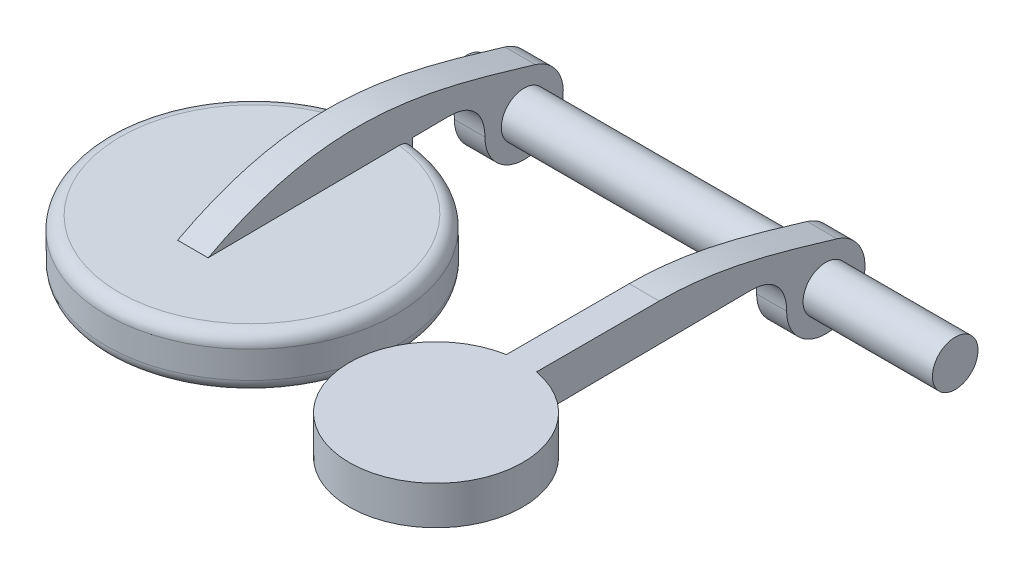
ISO-10303-21;
HEADER;
FILE_DESCRIPTION(('STEP AP214'),'2;1');
FILE_NAME('part.step','',(''),(''),'','','');
FILE_SCHEMA(('AUTOMOTIVE_DESIGN { 1 0 10303 214 1 1 1 1 }'));
ENDSEC;
DATA;
#1=APPLICATION_CONTEXT('core data for automotive mechanical design processes');
#2=APPLICATION_PROTOCOL_DEFINITION('international standard','automotive_design',2000,#1);
#3=PRODUCT_CONTEXT('',#1,'mechanical');
#4=PRODUCT('Part','Part','',(#3));
#5=PRODUCT_RELATED_PRODUCT_CATEGORY('part','',(#4));
#6=PRODUCT_DEFINITION_FORMATION('','',#4);
#7=PRODUCT_DEFINITION_CONTEXT('part definition',#1,'design');
#8=PRODUCT_DEFINITION('design','',#6,#7);
#9=PRODUCT_DEFINITION_SHAPE('','',#8);
#10=(LENGTH_UNIT() NAMED_UNIT(*) SI_UNIT(.MILLI.,.METRE.));
#11=(NAMED_UNIT(*) PLANE_ANGLE_UNIT() SI_UNIT($,.RADIAN.));
#12=(NAMED_UNIT(*) SI_UNIT($,.STERADIAN.) SOLID_ANGLE_UNIT());
#13=UNCERTAINTY_MEASURE_WITH_UNIT(LENGTH_MEASURE(1.E-05),#10,'distance_accuracy_value','');
#14=(GEOMETRIC_REPRESENTATION_CONTEXT(3) GLOBAL_UNCERTAINTY_ASSIGNED_CONTEXT((#13)) GLOBAL_UNIT_ASSIGNED_CONTEXT((#10,
#11,#12)) REPRESENTATION_CONTEXT('',''));
#15=CARTESIAN_POINT('',(0.,0.,0.));
#16=DIRECTION('',(0.,0.,1.));
#17=DIRECTION('',(1.,0.,0.));
#18=AXIS2_PLACEMENT_3D('',#15,#16,#17);
#19=CARTESIAN_POINT('',(35.2298,7.12391670081777,29.0513749527694));
#20=DIRECTION('',(0.,0.,-1.));
#21=DIRECTION('',(0.,1.,0.));
#22=AXIS2_PLACEMENT_3D('',#19,#20,#21);
#23=PLANE('',#22);
#24=DIRECTION('',(1.,0.,0.));
#25=VECTOR('',#24,1.);
#26=CARTESIAN_POINT('',(35.2298,3.34153169983561,29.0513749527694));
#27=LINE('',#26,#25);
#28=CARTESIAN_POINT('',(32.2834,3.34153169983561,29.0513749527694));
#29=VERTEX_POINT('',#28);
#30=CARTESIAN_POINT('',(35.2298,3.34153169983561,29.0513749527694));
#31=VERTEX_POINT('',#30);
#32=EDGE_CURVE('E669',#29,#31,#27,.T.);
#33=ORIENTED_EDGE('',*,*,#32,.F.);
#34=DIRECTION('',(0.,-1.,0.));
#35=VECTOR('',#34,1.);
#36=CARTESIAN_POINT('',(32.2834,7.12391670081777,29.0513749527694));
#37=LINE('',#36,#35);
#38=CARTESIAN_POINT('',(32.2834,3.33429589993566,29.0513749527694));
#39=VERTEX_POINT('',#38);
#40=EDGE_CURVE('E623',#29,#39,#37,.T.);
#41=ORIENTED_EDGE('',*,*,#40,.T.);
#42=DIRECTION('',(-1.,0.,0.));
#43=VECTOR('',#42,1.);
#44=CARTESIAN_POINT('',(35.2298,3.33429589993566,29.0513749527694));
#45=LINE('',#44,#43);
#46=CARTESIAN_POINT('',(35.2298,3.33429589993566,29.0513749527694));
#47=VERTEX_POINT('',#46);
#48=EDGE_CURVE('E649',#47,#39,#45,.T.);
#49=ORIENTED_EDGE('',*,*,#48,.F.);
#50=DIRECTION('',(0.,-1.,0.));
#51=VECTOR('',#50,1.);
#52=CARTESIAN_POINT('',(35.2298,7.12391670081777,29.0513749527694));
#53=LINE('',#52,#51);
#54=EDGE_CURVE('E174',#31,#47,#53,.T.);
#55=ORIENTED_EDGE('',*,*,#54,.F.);
#56=EDGE_LOOP('',(#33,#41,#49,#55));
#57=FACE_BOUND('',#56,.T.);
#58=ADVANCED_FACE('F39',(#57),#23,.F.);
#59=CARTESIAN_POINT('',(35.2298,6.06436235293988,7.59443350800524));
#60=DIRECTION('',(-1.,0.,0.));
#61=DIRECTION('',(0.,0.,1.));
#62=AXIS2_PLACEMENT_3D('',#59,#60,#61);
#63=PLANE('',#62);
#64=CARTESIAN_POINT('',(35.2298,0.,0.));
#65=DIRECTION('',(-1.,0.,0.));
#66=DIRECTION('',(0.,0.,1.));
#67=AXIS2_PLACEMENT_3D('',#64,#65,#66);
#68=CIRCLE('',#67,2.2352);
#69=CARTESIAN_POINT('',(35.2298,0.,2.2352));
#70=VERTEX_POINT('',#69);
#71=EDGE_CURVE('E251',#70,#70,#68,.T.);
#72=ORIENTED_EDGE('',*,*,#71,.T.);
#73=EDGE_LOOP('',(#72));
#74=FACE_BOUND('',#73,.T.);
#75=DIRECTION('',(0.,1.,0.));
#76=VECTOR('',#75,1.);
#77=CARTESIAN_POINT('',(35.2298,7.12391670081777,28.4061917155948));
#78=LINE('',#77,#76);
#79=CARTESIAN_POINT('',(35.2298,3.34153169983561,28.4061917155948));
#80=VERTEX_POINT('',#79);
#81=CARTESIAN_POINT('',(35.2298,7.12391670081777,28.4061917155948));
#82=VERTEX_POINT('',#81);
#83=EDGE_CURVE('E147',#80,#82,#78,.T.);
#84=ORIENTED_EDGE('',*,*,#83,.F.);
#85=DIRECTION('',(0.,0.,-1.));
#86=VECTOR('',#85,1.);
#87=CARTESIAN_POINT('',(35.2298,3.34153169983561,7.59443350800524));
#88=LINE('',#87,#86);
#89=EDGE_CURVE('E158',#31,#80,#88,.T.);
#90=ORIENTED_EDGE('',*,*,#89,.F.);
#91=ORIENTED_EDGE('',*,*,#54,.T.);
#92=DIRECTION('',(0.,0.00935198459330915,-0.999956269235893));
#93=VECTOR('',#92,1.);
#94=CARTESIAN_POINT('',(35.2298,3.33429589993566,29.0513749527694));
#95=LINE('',#94,#93);
#96=CARTESIAN_POINT('',(35.2298,3.53607699929893,7.47603195381129));
#97=VERTEX_POINT('',#96);
#98=EDGE_CURVE('E178',#47,#97,#95,.T.);
#99=ORIENTED_EDGE('',*,*,#98,.T.);
#100=CARTESIAN_POINT('',(35.2298,3.53607699929893,7.47603195381129));
#101=CARTESIAN_POINT('',(35.2298,3.54651463477211,6.35999300793146));
#102=CARTESIAN_POINT('',(35.2298,2.93410125259208,4.61869351978473));
#103=CARTESIAN_POINT('',(35.2298,1.17220412261583,3.84810000000003));
#104=CARTESIAN_POINT('',(35.2298,0.,3.84810000000003));
#105=B_SPLINE_CURVE_WITH_KNOTS('',3,(#100,#101,#102,#103,#104),.UNSPECIFIED.,.F.,.F.,(4,1,4),
(0.,0.48535143959245,1.),.UNSPECIFIED.);
#106=CARTESIAN_POINT('',(35.2298,0.,3.84810000000003));
#107=VERTEX_POINT('',#106);
#108=EDGE_CURVE('E188',#97,#107,#105,.T.);
#109=ORIENTED_EDGE('',*,*,#108,.T.);
#110=CARTESIAN_POINT('',(35.2298,0.,0.));
#111=DIRECTION('',(1.,0.,0.));
#112=DIRECTION('',(0.,0.,-1.));
#113=AXIS2_PLACEMENT_3D('',#110,#111,#112);
#114=CIRCLE('',#113,3.84810000000002);
#115=CARTESIAN_POINT('',(35.2298,3.6860916578753,-1.10480853533195));
#116=VERTEX_POINT('',#115);
#117=EDGE_CURVE('E194',#107,#116,#114,.T.);
#118=ORIENTED_EDGE('',*,*,#117,.T.);
#119=CARTESIAN_POINT('',(35.2298,3.6860916578753,-1.10480853533195));
#120=CARTESIAN_POINT('',(35.2298,5.44438012079105,4.7615585572655));
#121=CARTESIAN_POINT('',(35.2298,7.12391670081761,10.4080753249363));
#122=CARTESIAN_POINT('',(35.2298,7.12391670081777,16.3513749527685));
#123=B_SPLINE_CURVE_WITH_KNOTS('',3,(#119,#120,#121,#122),.UNSPECIFIED.,.F.,.F.,(4,4),(0.,
0.562301624485056),.UNSPECIFIED.);
#124=CARTESIAN_POINT('',(35.2298,7.12391670081777,16.3513749527694));
#125=VERTEX_POINT('',#124);
#126=EDGE_CURVE('E171',#116,#125,#123,.T.);
#127=ORIENTED_EDGE('',*,*,#126,.T.);
#128=DIRECTION('',(0.,0.,1.));
#129=VECTOR('',#128,1.);
#130=CARTESIAN_POINT('',(35.2298,7.12391670081777,16.3513749527694));
#131=LINE('',#130,#129);
#132=EDGE_CURVE('E164',#125,#82,#131,.T.);
#133=ORIENTED_EDGE('',*,*,#132,.T.);
#134=EDGE_LOOP('',(#84,#90,#91,#99,#109,#118,#127,#133));
#135=FACE_BOUND('',#134,.T.);
#136=ADVANCED_FACE('F169',(#74,#135),#63,.F.);
#137=CARTESIAN_POINT('',(32.2834,6.06436235293988,7.59443350800524));
#138=DIRECTION('',(-1.,0.,0.));
#139=DIRECTION('',(0.,0.,1.));
#140=AXIS2_PLACEMENT_3D('',#137,#138,#139);
#141=PLANE('',#140);
#142=CARTESIAN_POINT('',(32.2834,0.,0.));
#143=DIRECTION('',(-1.,0.,0.));
#144=DIRECTION('',(0.,0.,1.));
#145=AXIS2_PLACEMENT_3D('',#142,#143,#144);
#146=CIRCLE('',#145,2.2352);
#147=CARTESIAN_POINT('',(32.2834,0.,2.2352));
#148=VERTEX_POINT('',#147);
#149=EDGE_CURVE('E258',#148,#148,#146,.T.);
#150=ORIENTED_EDGE('',*,*,#149,.F.);
#151=EDGE_LOOP('',(#150));
#152=FACE_BOUND('',#151,.T.);
#153=DIRECTION('',(0.,0.,-1.));
#154=VECTOR('',#153,1.);
#155=CARTESIAN_POINT('',(32.2834,3.34153169983561,7.59443350800524));
#156=LINE('',#155,#154);
#157=CARTESIAN_POINT('',(32.2834,3.34153169983561,28.4061917155948));
#158=VERTEX_POINT('',#157);
#159=EDGE_CURVE('E48',#29,#158,#156,.T.);
#160=ORIENTED_EDGE('',*,*,#159,.T.);
#161=DIRECTION('',(0.,1.,0.));
#162=VECTOR('',#161,1.);
#163=CARTESIAN_POINT('',(32.2834,7.12391670081777,28.4061917155948));
#164=LINE('',#163,#162);
#165=CARTESIAN_POINT('',(32.2834,7.12391670081777,28.4061917155948));
#166=VERTEX_POINT('',#165);
#167=EDGE_CURVE('E11',#158,#166,#164,.T.);
#168=ORIENTED_EDGE('',*,*,#167,.T.);
#169=DIRECTION('',(0.,0.,1.));
#170=VECTOR('',#169,1.);
#171=CARTESIAN_POINT('',(32.2834,7.12391670081777,16.3513749527694));
#172=LINE('',#171,#170);
#173=CARTESIAN_POINT('',(32.2834,7.12391670081777,16.3513749527694));
#174=VERTEX_POINT('',#173);
#175=EDGE_CURVE('E166',#174,#166,#172,.T.);
#176=ORIENTED_EDGE('',*,*,#175,.F.);
#177=CARTESIAN_POINT('',(32.2834,3.6860916578753,-1.10480853533195));
#178=CARTESIAN_POINT('',(32.2834,5.44438012079105,4.7615585572655));
#179=CARTESIAN_POINT('',(32.2834,7.12391670081761,10.4080753249363));
#180=CARTESIAN_POINT('',(32.2834,7.12391670081777,16.3513749527685));
#181=B_SPLINE_CURVE_WITH_KNOTS('',3,(#177,#178,#179,#180),.UNSPECIFIED.,.F.,.F.,(4,4),(0.,
0.562301624485056),.UNSPECIFIED.);
#182=CARTESIAN_POINT('',(32.2834,3.6860916578753,-1.10480853533195));
#183=VERTEX_POINT('',#182);
#184=EDGE_CURVE('E157',#183,#174,#181,.T.);
#185=ORIENTED_EDGE('',*,*,#184,.F.);
#186=CARTESIAN_POINT('',(32.2834,0.,0.));
#187=DIRECTION('',(1.,0.,0.));
#188=DIRECTION('',(0.,0.,-1.));
#189=AXIS2_PLACEMENT_3D('',#186,#187,#188);
#190=CIRCLE('',#189,3.84810000000002);
#191=CARTESIAN_POINT('',(32.2834,0.,3.84810000000003));
#192=VERTEX_POINT('',#191);
#193=EDGE_CURVE('E180',#192,#183,#190,.T.);
#194=ORIENTED_EDGE('',*,*,#193,.F.);
#195=CARTESIAN_POINT('',(32.2834,3.53607699929893,7.47603195381129));
#196=CARTESIAN_POINT('',(32.2834,3.54651463477211,6.35999300793146));
#197=CARTESIAN_POINT('',(32.2834,2.93410125259208,4.61869351978473));
#198=CARTESIAN_POINT('',(32.2834,1.17220412261583,3.84810000000003));
#199=CARTESIAN_POINT('',(32.2834,0.,3.84810000000003));
#200=B_SPLINE_CURVE_WITH_KNOTS('',3,(#195,#196,#197,#198,#199),.UNSPECIFIED.,.F.,.F.,(4,1,4),
(0.,0.48535143959245,1.),.UNSPECIFIED.);
#201=CARTESIAN_POINT('',(32.2834,3.53607699929893,7.47603195381129));
#202=VERTEX_POINT('',#201);
#203=EDGE_CURVE('E615',#202,#192,#200,.T.);
#204=ORIENTED_EDGE('',*,*,#203,.F.);
#205=DIRECTION('',(0.,0.00935198459330915,-0.999956269235893));
#206=VECTOR('',#205,1.);
#207=CARTESIAN_POINT('',(32.2834,3.33429589993566,29.0513749527694));
#208=LINE('',#207,#206);
#209=EDGE_CURVE('E633',#39,#202,#208,.T.);
#210=ORIENTED_EDGE('',*,*,#209,.F.);
#211=ORIENTED_EDGE('',*,*,#40,.F.);
#212=EDGE_LOOP('',(#160,#168,#176,#185,#194,#204,#210,#211));
#213=FACE_BOUND('',#212,.T.);
#214=ADVANCED_FACE('F463',(#152,#213),#141,.T.);
#215=CARTESIAN_POINT('',(47.9298,0.,0.));
#216=DIRECTION('',(-1.,0.,0.));
#217=DIRECTION('',(0.,0.,1.));
#218=AXIS2_PLACEMENT_3D('',#215,#216,#217);
#219=CYLINDRICAL_SURFACE('',#218,2.2352);
#220=ORIENTED_EDGE('',*,*,#149,.T.);
#221=EDGE_LOOP('',(#220));
#222=FACE_BOUND('',#221,.T.);
#223=CARTESIAN_POINT('',(5.6134,0.,0.));
#224=DIRECTION('',(-1.,0.,0.));
#225=DIRECTION('',(0.,0.,1.));
#226=AXIS2_PLACEMENT_3D('',#223,#224,#225);
#227=CIRCLE('',#226,2.2352);
#228=CARTESIAN_POINT('',(5.6134,0.,2.2352));
#229=VERTEX_POINT('',#228);
#230=EDGE_CURVE('E377',#229,#229,#227,.T.);
#231=ORIENTED_EDGE('',*,*,#230,.F.);
#232=EDGE_LOOP('',(#231));
#233=FACE_BOUND('',#232,.T.);
#234=ADVANCED_FACE('F270',(#222,#233),#219,.T.);
#235=CARTESIAN_POINT('',(5.6134,3.6860916578753,-1.10480853533195));
#236=CARTESIAN_POINT('',(5.6134,6.81304058768846,9.32796782018675));
#237=CARTESIAN_POINT('',(5.6134,9.69091903055826,19.0654182295158));
#238=CARTESIAN_POINT('',(5.6134,3.31594626947891,31.0134));
#239=B_SPLINE_CURVE_WITH_KNOTS('',3,(#235,#236,#237,#238),.UNSPECIFIED.,.F.,.F.,(4,4),(0.,1.),.UNSPECIFIED.);
#240=DIRECTION('',(-1.,0.,0.));
#241=VECTOR('',#240,1.);
#242=SURFACE_OF_LINEAR_EXTRUSION('',#239,#241);
#243=CARTESIAN_POINT('',(2.6162,3.6860916578753,-1.10480853533195));
#244=CARTESIAN_POINT('',(2.6162,6.81304058768846,9.32796782018675));
#245=CARTESIAN_POINT('',(2.6162,9.69091903055826,19.0654182295158));
#246=CARTESIAN_POINT('',(2.6162,3.31594626947891,31.0134));
#247=B_SPLINE_CURVE_WITH_KNOTS('',3,(#243,#244,#245,#246),.UNSPECIFIED.,.F.,.F.,(4,4),(0.,1.),.UNSPECIFIED.);
#248=CARTESIAN_POINT('',(2.6162,3.68609165787529,-1.10480853533194));
#249=VERTEX_POINT('',#248);
#250=CARTESIAN_POINT('',(2.6162,3.31594626947891,31.0134));
#251=VERTEX_POINT('',#250);
#252=EDGE_CURVE('E338',#249,#251,#247,.T.);
#253=ORIENTED_EDGE('',*,*,#252,.T.);
#254=DIRECTION('',(-1.,0.,0.));
#255=VECTOR('',#254,1.);
#256=CARTESIAN_POINT('',(5.6134,3.31594626947891,31.0134));
#257=LINE('',#256,#255);
#258=CARTESIAN_POINT('',(5.6134,3.31594626947891,31.0134));
#259=VERTEX_POINT('',#258);
#260=EDGE_CURVE('E369',#259,#251,#257,.T.);
#261=ORIENTED_EDGE('',*,*,#260,.F.);
#262=CARTESIAN_POINT('',(5.6134,3.68609165787529,-1.10480853533194));
#263=VERTEX_POINT('',#262);
#264=EDGE_CURVE('E285',#263,#259,#239,.T.);
#265=ORIENTED_EDGE('',*,*,#264,.F.);
#266=DIRECTION('',(-1.,0.,0.));
#267=VECTOR('',#266,1.);
#268=CARTESIAN_POINT('',(5.6134,3.68609165787529,-1.10480853533194));
#269=LINE('',#268,#267);
#270=EDGE_CURVE('E326',#263,#249,#269,.T.);
#271=ORIENTED_EDGE('',*,*,#270,.T.);
#272=EDGE_LOOP('',(#253,#261,#265,#271));
#273=FACE_BOUND('',#272,.T.);
#274=ADVANCED_FACE('F278',(#273),#242,.F.);
#275=CARTESIAN_POINT('',(5.6134,3.31594626947891,31.0134));
#276=DIRECTION('',(0.,0.999956269235893,0.00935198459330916));
#277=DIRECTION('',(0.,-0.00935198459330916,0.999956269235893));
#278=AXIS2_PLACEMENT_3D('',#275,#276,#277);
#279=PLANE('',#278);
#280=CARTESIAN_POINT('',(4.1148,3.37021523518662,25.2107180191933));
#281=DIRECTION('',(0.,-0.999956269235894,-0.00935198459330916));
#282=DIRECTION('',(0.,0.00935198459330916,-0.999956269235894));
#283=AXIS2_PLACEMENT_3D('',#280,#281,#282);
#284=CIRCLE('',#283,14.3129);
#285=CARTESIAN_POINT('',(2.6162,3.50333353509295,10.9771104663545));
#286=VERTEX_POINT('',#285);
#287=CARTESIAN_POINT('',(5.6134,3.50333353509295,10.9771104663545));
#288=VERTEX_POINT('',#287);
#289=EDGE_CURVE('E294',#286,#288,#284,.T.);
#290=ORIENTED_EDGE('',*,*,#289,.F.);
#291=DIRECTION('',(0.,0.00935198459330916,-0.999956269235893));
#292=VECTOR('',#291,1.);
#293=CARTESIAN_POINT('',(2.6162,3.31594626947891,31.0134));
#294=LINE('',#293,#292);
#295=CARTESIAN_POINT('',(2.6162,3.53607699929893,7.47603195381129));
#296=VERTEX_POINT('',#295);
#297=EDGE_CURVE('E345',#286,#296,#294,.T.);
#298=ORIENTED_EDGE('',*,*,#297,.T.);
#299=DIRECTION('',(-1.,0.,0.));
#300=VECTOR('',#299,1.);
#301=CARTESIAN_POINT('',(5.6134,3.53607699929893,7.47603195381129));
#302=LINE('',#301,#300);
#303=CARTESIAN_POINT('',(5.6134,3.53607699929893,7.47603195381129));
#304=VERTEX_POINT('',#303);
#305=EDGE_CURVE('E365',#304,#296,#302,.T.);
#306=ORIENTED_EDGE('',*,*,#305,.F.);
#307=DIRECTION('',(0.,0.00935198459330916,-0.999956269235893));
#308=VECTOR('',#307,1.);
#309=CARTESIAN_POINT('',(5.6134,3.31594626947891,31.0134));
#310=LINE('',#309,#308);
#311=EDGE_CURVE('E292',#288,#304,#310,.T.);
#312=ORIENTED_EDGE('',*,*,#311,.F.);
#313=EDGE_LOOP('',(#290,#298,#306,#312));
#314=FACE_BOUND('',#313,.T.);
#315=ADVANCED_FACE('F282',(#314),#279,.F.);
#316=CARTESIAN_POINT('',(5.6134,3.53607699929893,7.47603195381129));
#317=CARTESIAN_POINT('',(5.6134,3.54651463477211,6.35999300793146));
#318=CARTESIAN_POINT('',(5.6134,2.93410125259208,4.61869351978473));
#319=CARTESIAN_POINT('',(5.6134,1.17220412261583,3.84810000000003));
#320=CARTESIAN_POINT('',(5.6134,0.,3.84810000000003));
#321=B_SPLINE_CURVE_WITH_KNOTS('',3,(#316,#317,#318,#319,#320),.UNSPECIFIED.,.F.,.F.,(4,1,4),
(0.,0.48535143959245,1.),.UNSPECIFIED.);
#322=DIRECTION('',(-1.,0.,0.));
#323=VECTOR('',#322,1.);
#324=SURFACE_OF_LINEAR_EXTRUSION('',#321,#323);
#325=CARTESIAN_POINT('',(2.6162,3.53607699929893,7.47603195381129));
#326=CARTESIAN_POINT('',(2.6162,3.54651463477211,6.35999300793146));
#327=CARTESIAN_POINT('',(2.6162,2.93410125259208,4.61869351978473));
#328=CARTESIAN_POINT('',(2.6162,1.17220412261583,3.84810000000003));
#329=CARTESIAN_POINT('',(2.6162,0.,3.84810000000003));
#330=B_SPLINE_CURVE_WITH_KNOTS('',3,(#325,#326,#327,#328,#329),.UNSPECIFIED.,.F.,.F.,(4,1,4),
(0.,0.48535143959245,1.),.UNSPECIFIED.);
#331=CARTESIAN_POINT('',(2.6162,0.,3.84810000000003));
#332=VERTEX_POINT('',#331);
#333=EDGE_CURVE('E334',#296,#332,#330,.T.);
#334=ORIENTED_EDGE('',*,*,#333,.T.);
#335=DIRECTION('',(-1.,0.,0.));
#336=VECTOR('',#335,1.);
#337=CARTESIAN_POINT('',(5.6134,0.,3.84810000000003));
#338=LINE('',#337,#336);
#339=CARTESIAN_POINT('',(5.6134,0.,3.84810000000003));
#340=VERTEX_POINT('',#339);
#341=EDGE_CURVE('E329',#340,#332,#338,.T.);
#342=ORIENTED_EDGE('',*,*,#341,.F.);
#343=EDGE_CURVE('E303',#304,#340,#321,.T.);
#344=ORIENTED_EDGE('',*,*,#343,.F.);
#345=ORIENTED_EDGE('',*,*,#305,.T.);
#346=EDGE_LOOP('',(#334,#342,#344,#345));
#347=FACE_BOUND('',#346,.T.);
#348=ADVANCED_FACE('F314',(#347),#324,.F.);
#349=CARTESIAN_POINT('',(5.6134,0.,0.));
#350=DIRECTION('',(-1.,0.,0.));
#351=DIRECTION('',(0.,0.,1.));
#352=AXIS2_PLACEMENT_3D('',#349,#350,#351);
#353=CYLINDRICAL_SURFACE('',#352,3.84810000000001);
#354=CARTESIAN_POINT('',(2.6162,0.,0.));
#355=DIRECTION('',(1.,0.,0.));
#356=DIRECTION('',(0.,0.,-1.));
#357=AXIS2_PLACEMENT_3D('',#354,#355,#356);
#358=CIRCLE('',#357,3.84810000000001);
#359=EDGE_CURVE('E293',#332,#249,#358,.T.);
#360=ORIENTED_EDGE('',*,*,#359,.T.);
#361=ORIENTED_EDGE('',*,*,#270,.F.);
#362=CARTESIAN_POINT('',(5.6134,0.,0.));
#363=DIRECTION('',(1.,0.,0.));
#364=DIRECTION('',(0.,0.,-1.));
#365=AXIS2_PLACEMENT_3D('',#362,#363,#364);
#366=CIRCLE('',#365,3.84810000000001);
#367=EDGE_CURVE('E309',#340,#263,#366,.T.);
#368=ORIENTED_EDGE('',*,*,#367,.F.);
#369=ORIENTED_EDGE('',*,*,#341,.T.);
#370=EDGE_LOOP('',(#360,#361,#368,#369));
#371=FACE_BOUND('',#370,.T.);
#372=ADVANCED_FACE('F238',(#371),#353,.T.);
#373=CARTESIAN_POINT('',(5.6134,7.0642395977618,14.3860937017219));
#374=DIRECTION('',(-1.,0.,0.));
#375=DIRECTION('',(0.,0.,1.));
#376=AXIS2_PLACEMENT_3D('',#373,#374,#375);
#377=PLANE('',#376);
#378=ORIENTED_EDGE('',*,*,#230,.T.);
#379=EDGE_LOOP('',(#378));
#380=FACE_BOUND('',#379,.T.);
#381=ORIENTED_EDGE('',*,*,#264,.T.);
#382=CARTESIAN_POINT('',(5.6134,3.49138442069289,12.2547635395541));
#383=VERTEX_POINT('',#382);
#384=EDGE_CURVE('E296',#259,#383,#310,.T.);
#385=ORIENTED_EDGE('',*,*,#384,.T.);
#386=CARTESIAN_POINT('',(5.6134,3.49138442069289,12.2547635395541));
#387=CARTESIAN_POINT('',(5.6134,3.49172181561903,12.2186489938396));
#388=CARTESIAN_POINT('',(5.6134,3.49053863151365,12.1825373954026));
#389=CARTESIAN_POINT('',(5.6134,3.4851425657969,12.1105424267928));
#390=CARTESIAN_POINT('',(5.6134,3.48092977434672,12.0746590498601));
#391=CARTESIAN_POINT('',(5.6134,3.46378063501387,11.9677847158064));
#392=CARTESIAN_POINT('',(5.6134,3.44633441994632,11.8974637440835));
#393=CARTESIAN_POINT('',(5.6134,3.3998723689284,11.760747218484));
#394=CARTESIAN_POINT('',(5.6134,3.37084995174271,11.6943539222445));
#395=CARTESIAN_POINT('',(5.6134,3.30203750094072,11.5674106030419));
#396=CARTESIAN_POINT('',(5.6134,3.26225005184668,11.5068591822598));
#397=CARTESIAN_POINT('',(5.6134,3.17316848253026,11.3935442439348));
#398=CARTESIAN_POINT('',(5.6134,3.1239071371896,11.3407549533369));
#399=CARTESIAN_POINT('',(5.6134,3.01716219725361,11.2442429928326));
#400=CARTESIAN_POINT('',(5.6134,2.95967707044917,11.200522016211));
#401=CARTESIAN_POINT('',(5.6134,2.83847941833533,11.1236645040085));
#402=CARTESIAN_POINT('',(5.6134,2.77480351492236,11.0904701463837));
#403=CARTESIAN_POINT('',(5.6134,2.64277785552356,11.0353212568758));
#404=CARTESIAN_POINT('',(5.6134,2.57443124987525,11.0133592320945));
#405=CARTESIAN_POINT('',(5.6134,2.46025280786942,10.9870907460616));
#406=CARTESIAN_POINT('',(5.6134,2.41519811420878,10.9792728752344));
#407=CARTESIAN_POINT('',(5.6134,2.32457290292804,10.9685584271976));
#408=CARTESIAN_POINT('',(5.6134,2.27900321633222,10.9656548189236));
#409=CARTESIAN_POINT('',(5.6134,2.23338907316337,10.965233445921));
#410=B_SPLINE_CURVE_WITH_KNOTS('',3,(#386,#387,#388,#389,#390,#391,#392,#393,#394,#395,#396,
#397,#398,#399,#400,#401,#402,#403,#404,#405,#406,#407,#408,#409),.UNSPECIFIED.,.F.,.F.,(4,2,2,
2,2,2,2,2,2,2,2,4),(0.,0.108282171437144,0.216561120526833,0.432805599335576,0.649173191827939,
0.865488883739623,1.08106927360954,1.2966898816527,1.5111047173678,1.72537633342126,
1.86231205917997,1.99905169847019),.UNSPECIFIED.);
#411=CARTESIAN_POINT('',(5.6134,2.23338907316337,10.965233445921));
#412=VERTEX_POINT('',#411);
#413=EDGE_CURVE('E243',#383,#412,#410,.T.);
#414=ORIENTED_EDGE('',*,*,#413,.T.);
#415=DIRECTION('',(0.,0.999956269235893,0.00935198459330915));
#416=VECTOR('',#415,1.);
#417=CARTESIAN_POINT('',(5.6134,3.50333353509295,10.9771104663545));
#418=LINE('',#417,#416);
#419=EDGE_CURVE('E58',#288,#412,#418,.F.);
#420=ORIENTED_EDGE('',*,*,#419,.F.);
#421=ORIENTED_EDGE('',*,*,#311,.T.);
#422=ORIENTED_EDGE('',*,*,#343,.T.);
#423=ORIENTED_EDGE('',*,*,#367,.T.);
#424=EDGE_LOOP('',(#381,#385,#414,#420,#421,#422,#423));
#425=FACE_BOUND('',#424,.T.);
#426=ADVANCED_FACE('F233',(#380,#425),#377,.F.);
#427=CARTESIAN_POINT('',(2.6162,7.0642395977618,14.3860937017219));
#428=DIRECTION('',(-1.,0.,0.));
#429=DIRECTION('',(0.,0.,1.));
#430=AXIS2_PLACEMENT_3D('',#427,#428,#429);
#431=PLANE('',#430);
#432=CARTESIAN_POINT('',(2.6162,0.,0.));
#433=DIRECTION('',(-1.,0.,0.));
#434=DIRECTION('',(0.,0.,1.));
#435=AXIS2_PLACEMENT_3D('',#432,#433,#434);
#436=CIRCLE('',#435,2.2352);
#437=CARTESIAN_POINT('',(2.6162,0.,2.2352));
#438=VERTEX_POINT('',#437);
#439=EDGE_CURVE('E372',#438,#438,#436,.T.);
#440=ORIENTED_EDGE('',*,*,#439,.F.);
#441=EDGE_LOOP('',(#440));
#442=FACE_BOUND('',#441,.T.);
#443=ORIENTED_EDGE('',*,*,#252,.F.);
#444=ORIENTED_EDGE('',*,*,#359,.F.);
#445=ORIENTED_EDGE('',*,*,#333,.F.);
#446=ORIENTED_EDGE('',*,*,#297,.F.);
#447=DIRECTION('',(0.,0.999956269235893,0.00935198459330915));
#448=VECTOR('',#447,1.);
#449=CARTESIAN_POINT('',(2.6162,2.23338907316337,10.965233445921));
#450=LINE('',#449,#448);
#451=CARTESIAN_POINT('',(2.6162,2.23338907316337,10.965233445921));
#452=VERTEX_POINT('',#451);
#453=EDGE_CURVE('E398',#452,#286,#450,.T.);
#454=ORIENTED_EDGE('',*,*,#453,.F.);
#455=CARTESIAN_POINT('',(2.6162,2.23338907316337,10.965233445921));
#456=CARTESIAN_POINT('',(2.6162,2.26897212076337,10.9655663751218));
#457=CARTESIAN_POINT('',(2.6162,2.30452400551476,10.9674035988677));
#458=CARTESIAN_POINT('',(2.6162,2.37534426550063,10.9740682674574));
#459=CARTESIAN_POINT('',(2.6162,2.41061265707685,10.9788955386719));
#460=CARTESIAN_POINT('',(2.6162,2.51554134908503,10.997812531462));
#461=CARTESIAN_POINT('',(2.6162,2.58445447459198,11.0163387776029));
#462=CARTESIAN_POINT('',(2.6162,2.71818776644814,11.0646916832044));
#463=CARTESIAN_POINT('',(2.6162,2.78300615662593,11.094523207812));
#464=CARTESIAN_POINT('',(2.6162,2.90673016990136,11.1646185402415));
#465=CARTESIAN_POINT('',(2.6162,2.96563659202381,11.2048809356504));
#466=CARTESIAN_POINT('',(2.6162,3.07601754881073,11.2947815417299));
#467=CARTESIAN_POINT('',(2.6162,3.12747482980064,11.3444409232444));
#468=CARTESIAN_POINT('',(2.6162,3.22138493374283,11.4516644566365));
#469=CARTESIAN_POINT('',(2.6162,3.26383594034141,11.509230199192));
#470=CARTESIAN_POINT('',(2.6162,3.33876302781429,11.6309500339318));
#471=CARTESIAN_POINT('',(2.6162,3.37118356008015,11.6951382795744));
#472=CARTESIAN_POINT('',(2.6162,3.42484281564229,11.8280149923299));
#473=CARTESIAN_POINT('',(2.6162,3.44608701429146,11.8967012372648));
#474=CARTESIAN_POINT('',(2.6162,3.4718610190758,12.0139331880872));
#475=CARTESIAN_POINT('',(2.6162,3.4795749750782,12.0618037547781));
#476=CARTESIAN_POINT('',(2.6162,3.48956227613683,12.158039665196));
#477=CARTESIAN_POINT('',(2.6162,3.49184340067598,12.2064042017309));
#478=CARTESIAN_POINT('',(2.6162,3.49138442069289,12.2547635395541));
#479=B_SPLINE_CURVE_WITH_KNOTS('',3,(#455,#456,#457,#458,#459,#460,#461,#462,#463,#464,#465,
#466,#467,#468,#469,#470,#471,#472,#473,#474,#475,#476,#477,#478),.UNSPECIFIED.,.F.,.F.,(4,2,2,
2,2,2,2,2,2,2,2,4),(0.,0.10668808653703,0.213369978375621,0.426350767405121,0.639423315489403,
0.852467027123645,1.06599655455798,1.27956910502501,1.49430407816417,1.70893375315561,
1.8541092399943,1.99907671908281),.UNSPECIFIED.);
#480=CARTESIAN_POINT('',(2.6162,3.49138442069289,12.2547635395541));
#481=VERTEX_POINT('',#480);
#482=EDGE_CURVE('E252',#452,#481,#479,.T.);
#483=ORIENTED_EDGE('',*,*,#482,.T.);
#484=EDGE_CURVE('E343',#251,#481,#294,.T.);
#485=ORIENTED_EDGE('',*,*,#484,.F.);
#486=EDGE_LOOP('',(#443,#444,#445,#446,#454,#483,#485));
#487=FACE_BOUND('',#486,.T.);
#488=ADVANCED_FACE('F237',(#442,#487),#431,.T.);
#489=CARTESIAN_POINT('',(0.,0.,0.));
#490=DIRECTION('',(1.,0.,0.));
#491=DIRECTION('',(0.,0.,-1.));
#492=AXIS2_PLACEMENT_3D('',#489,#490,#491);
#493=PLANE('',#492);
#494=CARTESIAN_POINT('',(0.,0.,0.));
#495=DIRECTION('',(1.,0.,0.));
#496=DIRECTION('',(0.,0.,-1.));
#497=AXIS2_PLACEMENT_3D('',#494,#495,#496);
#498=CIRCLE('',#497,2.2352);
#499=CARTESIAN_POINT('',(0.,0.,-2.2352));
#500=VERTEX_POINT('',#499);
#501=EDGE_CURVE('E378',#500,#500,#498,.T.);
#502=ORIENTED_EDGE('',*,*,#501,.F.);
#503=EDGE_LOOP('',(#502));
#504=FACE_BOUND('',#503,.T.);
#505=ADVANCED_FACE('F267',(#504),#493,.F.);
#506=ORIENTED_EDGE('',*,*,#439,.T.);
#507=EDGE_LOOP('',(#506));
#508=FACE_BOUND('',#507,.T.);
#509=ORIENTED_EDGE('',*,*,#501,.T.);
#510=EDGE_LOOP('',(#509));
#511=FACE_BOUND('',#510,.T.);
#512=ADVANCED_FACE('F228',(#508,#511),#219,.T.);
#513=CARTESIAN_POINT('',(4.1148,3.37021523518662,25.2107180191933));
#514=DIRECTION('',(0.,-0.999956269235894,-0.00935198459330916));
#515=DIRECTION('',(0.,0.00935198459330916,-0.999956269235894));
#516=AXIS2_PLACEMENT_3D('',#513,#514,#515);
#517=PLANE('',#516);
#518=ORIENTED_EDGE('',*,*,#484,.T.);
#519=CARTESIAN_POINT('',(4.1148,3.37021523518662,25.2107180191933));
#520=DIRECTION('',(0.,-0.999956269235894,-0.00935198459330916));
#521=DIRECTION('',(0.,0.00935198459330916,-0.999956269235894));
#522=AXIS2_PLACEMENT_3D('',#519,#520,#521);
#523=CIRCLE('',#522,13.0429);
#524=EDGE_CURVE('E401',#481,#383,#523,.F.);
#525=ORIENTED_EDGE('',*,*,#524,.T.);
#526=ORIENTED_EDGE('',*,*,#384,.F.);
#527=ORIENTED_EDGE('',*,*,#260,.T.);
#528=EDGE_LOOP('',(#518,#525,#526,#527));
#529=FACE_BOUND('',#528,.T.);
#530=ADVANCED_FACE('F225',(#529),#517,.F.);
#531=CARTESIAN_POINT('',(4.1148,-1.83655705872467,25.162022235416));
#532=DIRECTION('',(0.,0.999956269235893,0.00935198459330915));
#533=DIRECTION('',(0.,-0.00935198459330916,0.999956269235894));
#534=AXIS2_PLACEMENT_3D('',#531,#532,#533);
#535=CYLINDRICAL_SURFACE('',#534,14.3129);
#536=CARTESIAN_POINT('',(4.1148,-0.566612596795089,25.1738992558495));
#537=DIRECTION('',(0.,-0.999956269235894,-0.00935198459330916));
#538=DIRECTION('',(0.,0.00935198459330916,-0.999956269235894));
#539=AXIS2_PLACEMENT_3D('',#536,#537,#538);
#540=CIRCLE('',#539,14.3129);
#541=CARTESIAN_POINT('',(4.1148,-0.432758576509514,10.8616251699031));
#542=VERTEX_POINT('',#541);
#543=EDGE_CURVE('E388',#542,#542,#540,.F.);
#544=ORIENTED_EDGE('',*,*,#543,.T.);
#545=EDGE_LOOP('',(#544));
#546=FACE_BOUND('',#545,.T.);
#547=CARTESIAN_POINT('',(4.1148,2.10027077325704,25.1988409987598));
#548=DIRECTION('',(0.,-0.999956269235894,-0.00935198459330916));
#549=DIRECTION('',(0.,0.00935198459330916,-0.999956269235894));
#550=AXIS2_PLACEMENT_3D('',#547,#548,#549);
#551=CIRCLE('',#550,14.3129);
#552=EDGE_CURVE('E394',#412,#452,#551,.T.);
#553=ORIENTED_EDGE('',*,*,#552,.T.);
#554=ORIENTED_EDGE('',*,*,#453,.T.);
#555=ORIENTED_EDGE('',*,*,#289,.T.);
#556=ORIENTED_EDGE('',*,*,#419,.T.);
#557=EDGE_LOOP('',(#553,#554,#555,#556));
#558=FACE_BOUND('',#557,.T.);
#559=ADVANCED_FACE('F223',(#546,#558),#535,.T.);
#560=CARTESIAN_POINT('',(4.1148,-1.83655705872467,25.162022235416));
#561=DIRECTION('',(0.,-0.999956269235894,-0.00935198459330916));
#562=DIRECTION('',(0.,0.00935198459330916,-0.999956269235894));
#563=AXIS2_PLACEMENT_3D('',#560,#561,#562);
#564=PLANE('',#563);
#565=CARTESIAN_POINT('',(4.1148,-1.83655705872467,25.162022235416));
#566=DIRECTION('',(0.,-0.999956269235894,-0.00935198459330916));
#567=DIRECTION('',(0.,0.00935198459330916,-0.999956269235894));
#568=AXIS2_PLACEMENT_3D('',#565,#566,#567);
#569=CIRCLE('',#568,13.0429);
#570=CARTESIAN_POINT('',(4.1148,-1.7145800588726,12.1196926113992));
#571=VERTEX_POINT('',#570);
#572=EDGE_CURVE('E403',#571,#571,#569,.T.);
#573=ORIENTED_EDGE('',*,*,#572,.T.);
#574=EDGE_LOOP('',(#573));
#575=FACE_BOUND('',#574,.T.);
#576=ADVANCED_FACE('F219',(#575),#564,.T.);
#577=CARTESIAN_POINT('',(4.1148,2.10027077325704,25.1988409987598));
#578=DIRECTION('',(0.,-0.999956269235894,-0.00935198459330916));
#579=DIRECTION('',(0.,0.00935198459330916,-0.999956269235894));
#580=AXIS2_PLACEMENT_3D('',#577,#578,#579);
#581=TOROIDAL_SURFACE('',#580,13.0429,1.27);
#582=ORIENTED_EDGE('',*,*,#413,.F.);
#583=ORIENTED_EDGE('',*,*,#524,.F.);
#584=ORIENTED_EDGE('',*,*,#482,.F.);
#585=ORIENTED_EDGE('',*,*,#552,.F.);
#586=EDGE_LOOP('',(#582,#583,#584,#585));
#587=FACE_BOUND('',#586,.T.);
#588=ADVANCED_FACE('F222',(#587),#581,.T.);
#589=CARTESIAN_POINT('',(4.1148,-0.566612596795089,25.1738992558495));
#590=DIRECTION('',(0.,-0.999956269235894,-0.00935198459330916));
#591=DIRECTION('',(0.,0.00935198459330916,-0.999956269235894));
#592=AXIS2_PLACEMENT_3D('',#589,#590,#591);
#593=TOROIDAL_SURFACE('',#592,13.0429,1.27);
#594=ORIENTED_EDGE('',*,*,#543,.F.);
#595=EDGE_LOOP('',(#594));
#596=FACE_BOUND('',#595,.T.);
#597=ORIENTED_EDGE('',*,*,#572,.F.);
#598=EDGE_LOOP('',(#597));
#599=FACE_BOUND('',#598,.T.);
#600=ADVANCED_FACE('F41',(#596,#599),#593,.T.);
#601=DIRECTION('',(-1.,0.,0.));
#602=VECTOR('',#601,1.);
#603=SURFACE_OF_LINEAR_EXTRUSION('',#123,#602);
#604=ORIENTED_EDGE('',*,*,#184,.T.);
#605=DIRECTION('',(-1.,0.,0.));
#606=VECTOR('',#605,1.);
#607=CARTESIAN_POINT('',(35.2298,7.12391670081777,16.3513749527694));
#608=LINE('',#607,#606);
#609=EDGE_CURVE('E652',#125,#174,#608,.T.);
#610=ORIENTED_EDGE('',*,*,#609,.F.);
#611=ORIENTED_EDGE('',*,*,#126,.F.);
#612=DIRECTION('',(-1.,0.,0.));
#613=VECTOR('',#612,1.);
#614=CARTESIAN_POINT('',(35.2298,3.6860916578753,-1.10480853533195));
#615=LINE('',#614,#613);
#616=EDGE_CURVE('E608',#116,#183,#615,.T.);
#617=ORIENTED_EDGE('',*,*,#616,.T.);
#618=EDGE_LOOP('',(#604,#610,#611,#617));
#619=FACE_BOUND('',#618,.T.);
#620=ADVANCED_FACE('F215',(#619),#603,.F.);
#621=CARTESIAN_POINT('',(35.2298,7.12391670081777,16.3513749527694));
#622=DIRECTION('',(0.,-1.,0.));
#623=DIRECTION('',(0.,0.,-1.));
#624=AXIS2_PLACEMENT_3D('',#621,#622,#623);
#625=PLANE('',#624);
#626=ORIENTED_EDGE('',*,*,#175,.T.);
#627=CARTESIAN_POINT('',(33.7566,7.12391670081777,36.7866906721009));
#628=DIRECTION('',(0.,1.,0.));
#629=DIRECTION('',(0.,0.,1.));
#630=AXIS2_PLACEMENT_3D('',#627,#628,#629);
#631=CIRCLE('',#630,8.509);
#632=EDGE_CURVE('E150',#166,#82,#631,.T.);
#633=ORIENTED_EDGE('',*,*,#632,.T.);
#634=ORIENTED_EDGE('',*,*,#132,.F.);
#635=ORIENTED_EDGE('',*,*,#609,.T.);
#636=EDGE_LOOP('',(#626,#633,#634,#635));
#637=FACE_BOUND('',#636,.T.);
#638=ADVANCED_FACE('F162',(#637),#625,.F.);
#639=CARTESIAN_POINT('',(35.2298,3.33429589993566,29.0513749527694));
#640=DIRECTION('',(0.,0.999956269235893,0.00935198459330915));
#641=DIRECTION('',(0.,-0.00935198459330915,0.999956269235893));
#642=AXIS2_PLACEMENT_3D('',#639,#640,#641);
#643=PLANE('',#642);
#644=CARTESIAN_POINT('',(33.7566,3.34153169983561,28.2776906721009));
#645=VERTEX_POINT('',#644);
#646=VERTEX_LOOP('',#645);
#647=FACE_BOUND('',#646,.T.);
#648=ORIENTED_EDGE('',*,*,#209,.T.);
#649=DIRECTION('',(-1.,0.,0.));
#650=VECTOR('',#649,1.);
#651=CARTESIAN_POINT('',(35.2298,3.53607699929893,7.47603195381129));
#652=LINE('',#651,#650);
#653=EDGE_CURVE('E645',#97,#202,#652,.T.);
#654=ORIENTED_EDGE('',*,*,#653,.F.);
#655=ORIENTED_EDGE('',*,*,#98,.F.);
#656=ORIENTED_EDGE('',*,*,#48,.T.);
#657=EDGE_LOOP('',(#648,#654,#655,#656));
#658=FACE_BOUND('',#657,.T.);
#659=ADVANCED_FACE('F205',(#647,#658),#643,.F.);
#660=DIRECTION('',(-1.,0.,0.));
#661=VECTOR('',#660,1.);
#662=SURFACE_OF_LINEAR_EXTRUSION('',#105,#661);
#663=ORIENTED_EDGE('',*,*,#203,.T.);
#664=DIRECTION('',(-1.,0.,0.));
#665=VECTOR('',#664,1.);
#666=CARTESIAN_POINT('',(35.2298,0.,3.84810000000003));
#667=LINE('',#666,#665);
#668=EDGE_CURVE('E610',#107,#192,#667,.T.);
#669=ORIENTED_EDGE('',*,*,#668,.F.);
#670=ORIENTED_EDGE('',*,*,#108,.F.);
#671=ORIENTED_EDGE('',*,*,#653,.T.);
#672=EDGE_LOOP('',(#663,#669,#670,#671));
#673=FACE_BOUND('',#672,.T.);
#674=ADVANCED_FACE('F200',(#673),#662,.F.);
#675=CARTESIAN_POINT('',(35.2298,0.,0.));
#676=DIRECTION('',(-1.,0.,0.));
#677=DIRECTION('',(0.,0.,1.));
#678=AXIS2_PLACEMENT_3D('',#675,#676,#677);
#679=CYLINDRICAL_SURFACE('',#678,3.84810000000002);
#680=ORIENTED_EDGE('',*,*,#193,.T.);
#681=ORIENTED_EDGE('',*,*,#616,.F.);
#682=ORIENTED_EDGE('',*,*,#117,.F.);
#683=ORIENTED_EDGE('',*,*,#668,.T.);
#684=EDGE_LOOP('',(#680,#681,#682,#683));
#685=FACE_BOUND('',#684,.T.);
#686=ADVANCED_FACE('F204',(#685),#679,.T.);
#687=CARTESIAN_POINT('',(47.9298,0.,0.));
#688=DIRECTION('',(1.,0.,0.));
#689=DIRECTION('',(0.,0.,-1.));
#690=AXIS2_PLACEMENT_3D('',#687,#688,#689);
#691=PLANE('',#690);
#692=CARTESIAN_POINT('',(47.9298,0.,0.));
#693=DIRECTION('',(1.,0.,0.));
#694=DIRECTION('',(0.,0.,-1.));
#695=AXIS2_PLACEMENT_3D('',#692,#693,#694);
#696=CIRCLE('',#695,2.2352);
#697=CARTESIAN_POINT('',(47.9298,0.,-2.2352));
#698=VERTEX_POINT('',#697);
#699=EDGE_CURVE('E373',#698,#698,#696,.T.);
#700=ORIENTED_EDGE('',*,*,#699,.T.);
#701=EDGE_LOOP('',(#700));
#702=FACE_BOUND('',#701,.T.);
#703=ADVANCED_FACE('F274',(#702),#691,.T.);
#704=ORIENTED_EDGE('',*,*,#699,.F.);
#705=EDGE_LOOP('',(#704));
#706=FACE_BOUND('',#705,.T.);
#707=ORIENTED_EDGE('',*,*,#71,.F.);
#708=EDGE_LOOP('',(#707));
#709=FACE_BOUND('',#708,.T.);
#710=ADVANCED_FACE('F269',(#706,#709),#219,.T.);
#711=CARTESIAN_POINT('',(33.7566,7.12391670081777,36.7866906721009));
#712=DIRECTION('',(0.,1.,0.));
#713=DIRECTION('',(0.,0.,1.));
#714=AXIS2_PLACEMENT_3D('',#711,#712,#713);
#715=CYLINDRICAL_SURFACE('',#714,8.509);
#716=CARTESIAN_POINT('',(33.7566,3.34153169983561,36.7866906721009));
#717=DIRECTION('',(0.,1.,0.));
#718=DIRECTION('',(0.,0.,1.));
#719=AXIS2_PLACEMENT_3D('',#716,#717,#718);
#720=CIRCLE('',#719,8.509);
#721=EDGE_CURVE('E152',#158,#80,#720,.T.);
#722=ORIENTED_EDGE('',*,*,#721,.T.);
#723=ORIENTED_EDGE('',*,*,#83,.T.);
#724=ORIENTED_EDGE('',*,*,#632,.F.);
#725=ORIENTED_EDGE('',*,*,#167,.F.);
#726=EDGE_LOOP('',(#722,#723,#724,#725));
#727=FACE_BOUND('',#726,.T.);
#728=ADVANCED_FACE('F149',(#727),#715,.T.);
#729=CARTESIAN_POINT('',(33.7566,3.34153169983561,28.2776906721009));
#730=DIRECTION('',(0.,1.,0.));
#731=DIRECTION('',(0.,0.,1.));
#732=AXIS2_PLACEMENT_3D('',#729,#730,#731);
#733=PLANE('',#732);
#734=ORIENTED_EDGE('',*,*,#32,.T.);
#735=ORIENTED_EDGE('',*,*,#89,.T.);
#736=ORIENTED_EDGE('',*,*,#721,.F.);
#737=ORIENTED_EDGE('',*,*,#159,.F.);
#738=EDGE_LOOP('',(#734,#735,#736,#737));
#739=FACE_BOUND('',#738,.T.);
#740=ADVANCED_FACE('F488',(#739),#733,.F.);
#741=CLOSED_SHELL('',(#58,#136,#214,#234,#274,#315,#348,#372,#426,#488,#505,#512,#530,#559,#576,
#588,#600,#620,#638,#659,#674,#686,#703,#710,#728,#740));
#742=MANIFOLD_SOLID_BREP('B2',#741);
#743=ADVANCED_BREP_SHAPE_REPRESENTATION('',(#18,#742),#14);
#744=SHAPE_DEFINITION_REPRESENTATION(#9,#743);
ENDSEC;
END-ISO-10303-21;
